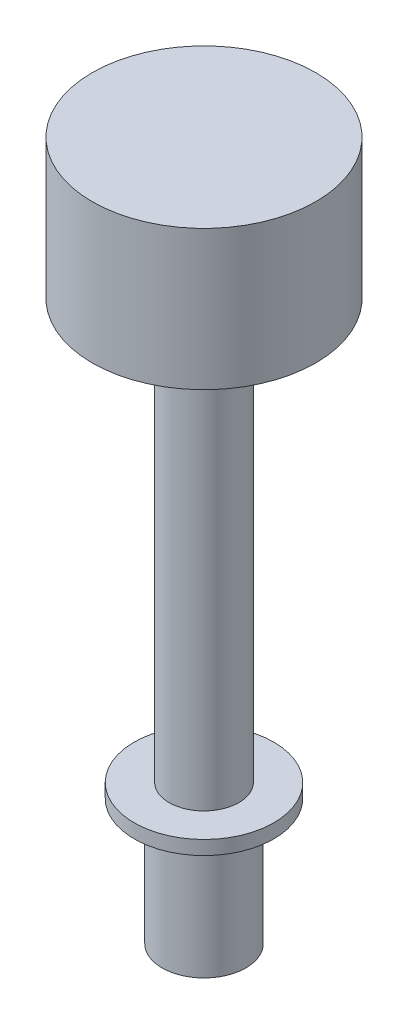
ISO-10303-21;
HEADER;
FILE_DESCRIPTION(('STEP AP214'),'2;1');
FILE_NAME('part.step','',(''),(''),'','','');
FILE_SCHEMA(('AUTOMOTIVE_DESIGN { 1 0 10303 214 1 1 1 1 }'));
ENDSEC;
DATA;
#1=APPLICATION_CONTEXT('core data for automotive mechanical design processes');
#2=APPLICATION_PROTOCOL_DEFINITION('international standard','automotive_design',2000,#1);
#3=PRODUCT_CONTEXT('',#1,'mechanical');
#4=PRODUCT('Part','Part','',(#3));
#5=PRODUCT_RELATED_PRODUCT_CATEGORY('part','',(#4));
#6=PRODUCT_DEFINITION_FORMATION('','',#4);
#7=PRODUCT_DEFINITION_CONTEXT('part definition',#1,'design');
#8=PRODUCT_DEFINITION('design','',#6,#7);
#9=PRODUCT_DEFINITION_SHAPE('','',#8);
#10=(LENGTH_UNIT() NAMED_UNIT(*) SI_UNIT(.MILLI.,.METRE.));
#11=(NAMED_UNIT(*) PLANE_ANGLE_UNIT() SI_UNIT($,.RADIAN.));
#12=(NAMED_UNIT(*) SI_UNIT($,.STERADIAN.) SOLID_ANGLE_UNIT());
#13=UNCERTAINTY_MEASURE_WITH_UNIT(LENGTH_MEASURE(1.E-05),#10,'distance_accuracy_value','');
#14=(GEOMETRIC_REPRESENTATION_CONTEXT(3) GLOBAL_UNCERTAINTY_ASSIGNED_CONTEXT((#13)) GLOBAL_UNIT_ASSIGNED_CONTEXT((#10,
#11,#12)) REPRESENTATION_CONTEXT('',''));
#15=CARTESIAN_POINT('',(0.,0.,0.));
#16=DIRECTION('',(0.,0.,1.));
#17=DIRECTION('',(1.,0.,0.));
#18=AXIS2_PLACEMENT_3D('',#15,#16,#17);
#19=CARTESIAN_POINT('',(-3.,-10.,0.));
#20=DIRECTION('',(0.,1.,0.));
#21=DIRECTION('',(0.,0.,1.));
#22=AXIS2_PLACEMENT_3D('',#19,#20,#21);
#23=PLANE('',#22);
#24=CARTESIAN_POINT('',(0.,-10.,0.));
#25=DIRECTION('',(0.,-1.,0.));
#26=DIRECTION('',(0.,0.,-1.));
#27=AXIS2_PLACEMENT_3D('',#24,#25,#26);
#28=CIRCLE('',#27,3.);
#29=CARTESIAN_POINT('',(0.,-10.,-3.));
#30=VERTEX_POINT('',#29);
#31=EDGE_CURVE('E59',#30,#30,#28,.T.);
#32=ORIENTED_EDGE('',*,*,#31,.T.);
#33=EDGE_LOOP('',(#32));
#34=FACE_BOUND('',#33,.T.);
#35=ADVANCED_FACE('F31',(#34),#23,.F.);
#36=CARTESIAN_POINT('',(0.,40.,0.));
#37=DIRECTION('',(0.,-1.,0.));
#38=DIRECTION('',(0.,0.,-1.));
#39=AXIS2_PLACEMENT_3D('',#36,#37,#38);
#40=PLANE('',#39);
#41=CARTESIAN_POINT('',(0.,40.,0.));
#42=DIRECTION('',(0.,-1.,0.));
#43=DIRECTION('',(0.,0.,-1.));
#44=AXIS2_PLACEMENT_3D('',#41,#42,#43);
#45=CIRCLE('',#44,8.);
#46=CARTESIAN_POINT('',(0.,40.,-8.));
#47=VERTEX_POINT('',#46);
#48=EDGE_CURVE('E10',#47,#47,#45,.T.);
#49=ORIENTED_EDGE('',*,*,#48,.F.);
#50=EDGE_LOOP('',(#49));
#51=FACE_BOUND('',#50,.T.);
#52=ADVANCED_FACE('F101',(#51),#40,.F.);
#53=CARTESIAN_POINT('',(0.,-10.,0.));
#54=DIRECTION('',(0.,-1.,0.));
#55=DIRECTION('',(0.,0.,-1.));
#56=AXIS2_PLACEMENT_3D('',#53,#54,#55);
#57=CYLINDRICAL_SURFACE('',#56,8.);
#58=CARTESIAN_POINT('',(0.,30.,0.));
#59=DIRECTION('',(0.,-1.,0.));
#60=DIRECTION('',(0.,0.,-1.));
#61=AXIS2_PLACEMENT_3D('',#58,#59,#60);
#62=CIRCLE('',#61,8.);
#63=CARTESIAN_POINT('',(0.,30.,-8.));
#64=VERTEX_POINT('',#63);
#65=EDGE_CURVE('E37',#64,#64,#62,.T.);
#66=ORIENTED_EDGE('',*,*,#65,.F.);
#67=EDGE_LOOP('',(#66));
#68=FACE_BOUND('',#67,.T.);
#69=ORIENTED_EDGE('',*,*,#48,.T.);
#70=EDGE_LOOP('',(#69));
#71=FACE_BOUND('',#70,.T.);
#72=ADVANCED_FACE('F96',(#68,#71),#57,.T.);
#73=CARTESIAN_POINT('',(-8.,30.,0.));
#74=DIRECTION('',(0.,1.,0.));
#75=DIRECTION('',(0.,0.,1.));
#76=AXIS2_PLACEMENT_3D('',#73,#74,#75);
#77=PLANE('',#76);
#78=CARTESIAN_POINT('',(0.,30.,0.));
#79=DIRECTION('',(0.,-1.,0.));
#80=DIRECTION('',(0.,0.,-1.));
#81=AXIS2_PLACEMENT_3D('',#78,#79,#80);
#82=CIRCLE('',#81,2.5);
#83=CARTESIAN_POINT('',(0.,30.,-2.5));
#84=VERTEX_POINT('',#83);
#85=EDGE_CURVE('E41',#84,#84,#82,.T.);
#86=ORIENTED_EDGE('',*,*,#85,.F.);
#87=EDGE_LOOP('',(#86));
#88=FACE_BOUND('',#87,.T.);
#89=ORIENTED_EDGE('',*,*,#65,.T.);
#90=EDGE_LOOP('',(#89));
#91=FACE_BOUND('',#90,.T.);
#92=ADVANCED_FACE('F91',(#88,#91),#77,.F.);
#93=CARTESIAN_POINT('',(0.,-10.,0.));
#94=DIRECTION('',(0.,-1.,0.));
#95=DIRECTION('',(0.,0.,-1.));
#96=AXIS2_PLACEMENT_3D('',#93,#94,#95);
#97=CYLINDRICAL_SURFACE('',#96,2.5);
#98=CARTESIAN_POINT('',(0.,0.,0.));
#99=DIRECTION('',(0.,-1.,0.));
#100=DIRECTION('',(0.,0.,-1.));
#101=AXIS2_PLACEMENT_3D('',#98,#99,#100);
#102=CIRCLE('',#101,2.5);
#103=CARTESIAN_POINT('',(0.,0.,-2.5));
#104=VERTEX_POINT('',#103);
#105=EDGE_CURVE('E45',#104,#104,#102,.T.);
#106=ORIENTED_EDGE('',*,*,#105,.F.);
#107=EDGE_LOOP('',(#106));
#108=FACE_BOUND('',#107,.T.);
#109=ORIENTED_EDGE('',*,*,#85,.T.);
#110=EDGE_LOOP('',(#109));
#111=FACE_BOUND('',#110,.T.);
#112=ADVANCED_FACE('F85',(#108,#111),#97,.T.);
#113=CARTESIAN_POINT('',(-2.5,0.,0.));
#114=DIRECTION('',(0.,-1.,0.));
#115=DIRECTION('',(0.,0.,-1.));
#116=AXIS2_PLACEMENT_3D('',#113,#114,#115);
#117=PLANE('',#116);
#118=CARTESIAN_POINT('',(0.,0.,0.));
#119=DIRECTION('',(0.,-1.,0.));
#120=DIRECTION('',(0.,0.,-1.));
#121=AXIS2_PLACEMENT_3D('',#118,#119,#120);
#122=CIRCLE('',#121,5.);
#123=CARTESIAN_POINT('',(0.,0.,-5.));
#124=VERTEX_POINT('',#123);
#125=EDGE_CURVE('E50',#124,#124,#122,.T.);
#126=ORIENTED_EDGE('',*,*,#125,.F.);
#127=EDGE_LOOP('',(#126));
#128=FACE_BOUND('',#127,.T.);
#129=ORIENTED_EDGE('',*,*,#105,.T.);
#130=EDGE_LOOP('',(#129));
#131=FACE_BOUND('',#130,.T.);
#132=ADVANCED_FACE('F79',(#128,#131),#117,.F.);
#133=CARTESIAN_POINT('',(0.,-10.,0.));
#134=DIRECTION('',(0.,-1.,0.));
#135=DIRECTION('',(0.,0.,-1.));
#136=AXIS2_PLACEMENT_3D('',#133,#134,#135);
#137=CYLINDRICAL_SURFACE('',#136,5.);
#138=CARTESIAN_POINT('',(0.,-1.,0.));
#139=DIRECTION('',(0.,-1.,0.));
#140=DIRECTION('',(0.,0.,-1.));
#141=AXIS2_PLACEMENT_3D('',#138,#139,#140);
#142=CIRCLE('',#141,5.);
#143=CARTESIAN_POINT('',(0.,-1.,-5.));
#144=VERTEX_POINT('',#143);
#145=EDGE_CURVE('E53',#144,#144,#142,.T.);
#146=ORIENTED_EDGE('',*,*,#145,.F.);
#147=EDGE_LOOP('',(#146));
#148=FACE_BOUND('',#147,.T.);
#149=ORIENTED_EDGE('',*,*,#125,.T.);
#150=EDGE_LOOP('',(#149));
#151=FACE_BOUND('',#150,.T.);
#152=ADVANCED_FACE('F73',(#148,#151),#137,.T.);
#153=CARTESIAN_POINT('',(-5.,-1.,0.));
#154=DIRECTION('',(0.,1.,0.));
#155=DIRECTION('',(0.,0.,1.));
#156=AXIS2_PLACEMENT_3D('',#153,#154,#155);
#157=PLANE('',#156);
#158=CARTESIAN_POINT('',(0.,-1.,0.));
#159=DIRECTION('',(0.,-1.,0.));
#160=DIRECTION('',(0.,0.,-1.));
#161=AXIS2_PLACEMENT_3D('',#158,#159,#160);
#162=CIRCLE('',#161,3.);
#163=CARTESIAN_POINT('',(0.,-1.,-3.));
#164=VERTEX_POINT('',#163);
#165=EDGE_CURVE('E56',#164,#164,#162,.T.);
#166=ORIENTED_EDGE('',*,*,#165,.F.);
#167=EDGE_LOOP('',(#166));
#168=FACE_BOUND('',#167,.T.);
#169=ORIENTED_EDGE('',*,*,#145,.T.);
#170=EDGE_LOOP('',(#169));
#171=FACE_BOUND('',#170,.T.);
#172=ADVANCED_FACE('F67',(#168,#171),#157,.F.);
#173=CARTESIAN_POINT('',(0.,-10.,0.));
#174=DIRECTION('',(0.,-1.,0.));
#175=DIRECTION('',(0.,0.,-1.));
#176=AXIS2_PLACEMENT_3D('',#173,#174,#175);
#177=CYLINDRICAL_SURFACE('',#176,3.);
#178=ORIENTED_EDGE('',*,*,#31,.F.);
#179=EDGE_LOOP('',(#178));
#180=FACE_BOUND('',#179,.T.);
#181=ORIENTED_EDGE('',*,*,#165,.T.);
#182=EDGE_LOOP('',(#181));
#183=FACE_BOUND('',#182,.T.);
#184=ADVANCED_FACE('F64',(#180,#183),#177,.T.);
#185=CLOSED_SHELL('',(#35,#52,#72,#92,#112,#132,#152,#172,#184));
#186=MANIFOLD_SOLID_BREP('B2',#185);
#187=ADVANCED_BREP_SHAPE_REPRESENTATION('',(#18,#186),#14);
#188=SHAPE_DEFINITION_REPRESENTATION(#9,#187);
ENDSEC;
END-ISO-10303-21;
